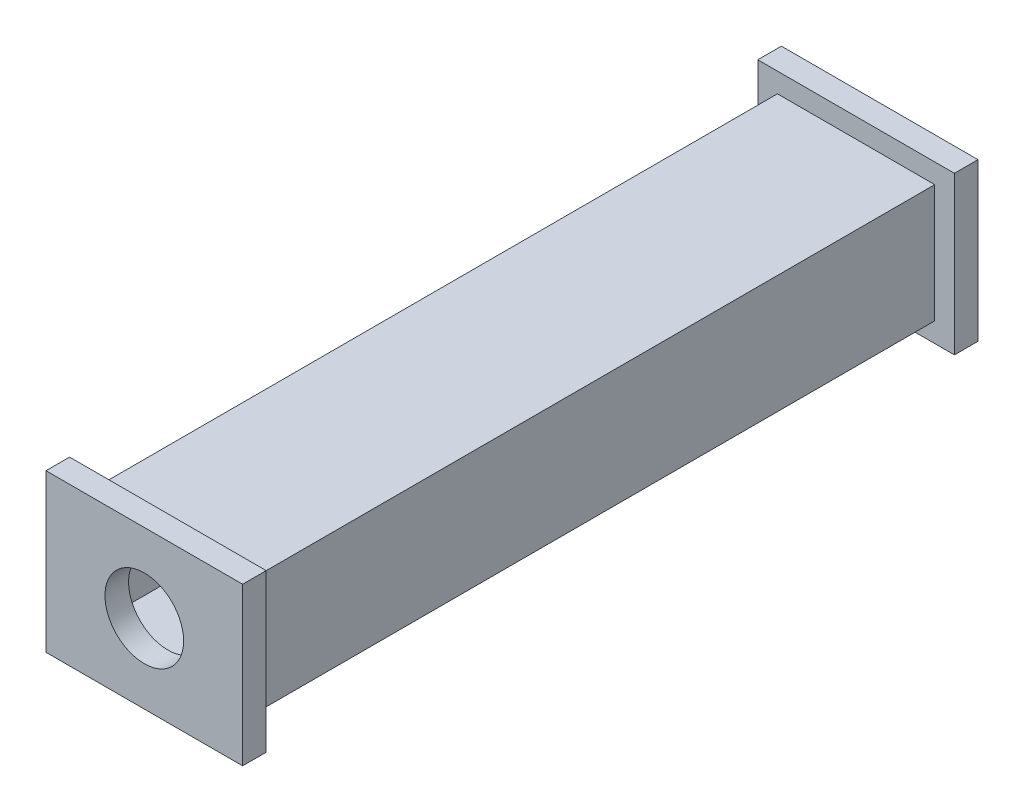
ISO-10303-21;
HEADER;
FILE_DESCRIPTION(('STEP AP214'),'2;1');
FILE_NAME('part.step','',(''),(''),'','','');
FILE_SCHEMA(('AUTOMOTIVE_DESIGN { 1 0 10303 214 1 1 1 1 }'));
ENDSEC;
DATA;
#1=APPLICATION_CONTEXT('core data for automotive mechanical design processes');
#2=APPLICATION_PROTOCOL_DEFINITION('international standard','automotive_design',2000,#1);
#3=PRODUCT_CONTEXT('',#1,'mechanical');
#4=PRODUCT('Part','Part','',(#3));
#5=PRODUCT_RELATED_PRODUCT_CATEGORY('part','',(#4));
#6=PRODUCT_DEFINITION_FORMATION('','',#4);
#7=PRODUCT_DEFINITION_CONTEXT('part definition',#1,'design');
#8=PRODUCT_DEFINITION('design','',#6,#7);
#9=PRODUCT_DEFINITION_SHAPE('','',#8);
#10=(LENGTH_UNIT() NAMED_UNIT(*) SI_UNIT(.MILLI.,.METRE.));
#11=(NAMED_UNIT(*) PLANE_ANGLE_UNIT() SI_UNIT($,.RADIAN.));
#12=(NAMED_UNIT(*) SI_UNIT($,.STERADIAN.) SOLID_ANGLE_UNIT());
#13=UNCERTAINTY_MEASURE_WITH_UNIT(LENGTH_MEASURE(1.E-05),#10,'distance_accuracy_value','');
#14=(GEOMETRIC_REPRESENTATION_CONTEXT(3) GLOBAL_UNCERTAINTY_ASSIGNED_CONTEXT((#13)) GLOBAL_UNIT_ASSIGNED_CONTEXT((#10,
#11,#12)) REPRESENTATION_CONTEXT('',''));
#15=CARTESIAN_POINT('',(0.,0.,0.));
#16=DIRECTION('',(0.,0.,1.));
#17=DIRECTION('',(1.,0.,0.));
#18=AXIS2_PLACEMENT_3D('',#15,#16,#17);
#19=CARTESIAN_POINT('',(-40.,30.,175.));
#20=DIRECTION('',(1.,0.,0.));
#21=DIRECTION('',(0.,0.,-1.));
#22=AXIS2_PLACEMENT_3D('',#19,#20,#21);
#23=PLANE('',#22);
#24=DIRECTION('',(0.,-1.,0.));
#25=VECTOR('',#24,1.);
#26=CARTESIAN_POINT('',(-40.,30.,-175.));
#27=LINE('',#26,#25);
#28=CARTESIAN_POINT('',(-40.,30.,-175.));
#29=VERTEX_POINT('',#28);
#30=CARTESIAN_POINT('',(-40.,-30.,-175.));
#31=VERTEX_POINT('',#30);
#32=EDGE_CURVE('E257',#29,#31,#27,.T.);
#33=ORIENTED_EDGE('',*,*,#32,.T.);
#34=DIRECTION('',(0.,0.,-1.));
#35=VECTOR('',#34,1.);
#36=CARTESIAN_POINT('',(-40.,-30.,175.));
#37=LINE('',#36,#35);
#38=CARTESIAN_POINT('',(-40.,-30.,175.));
#39=VERTEX_POINT('',#38);
#40=EDGE_CURVE('E11',#39,#31,#37,.T.);
#41=ORIENTED_EDGE('',*,*,#40,.F.);
#42=DIRECTION('',(0.,-1.,0.));
#43=VECTOR('',#42,1.);
#44=CARTESIAN_POINT('',(-40.,30.,175.));
#45=LINE('',#44,#43);
#46=CARTESIAN_POINT('',(-40.,30.,175.));
#47=VERTEX_POINT('',#46);
#48=EDGE_CURVE('E258',#47,#39,#45,.T.);
#49=ORIENTED_EDGE('',*,*,#48,.F.);
#50=DIRECTION('',(0.,0.,-1.));
#51=VECTOR('',#50,1.);
#52=CARTESIAN_POINT('',(-40.,30.,175.));
#53=LINE('',#52,#51);
#54=EDGE_CURVE('E271',#47,#29,#53,.T.);
#55=ORIENTED_EDGE('',*,*,#54,.T.);
#56=EDGE_LOOP('',(#33,#41,#49,#55));
#57=FACE_BOUND('',#56,.T.);
#58=ADVANCED_FACE('F39',(#57),#23,.F.);
#59=CARTESIAN_POINT('',(-40.,-30.,175.));
#60=DIRECTION('',(0.,1.,0.));
#61=DIRECTION('',(0.,0.,1.));
#62=AXIS2_PLACEMENT_3D('',#59,#60,#61);
#63=PLANE('',#62);
#64=DIRECTION('',(1.,0.,0.));
#65=VECTOR('',#64,1.);
#66=CARTESIAN_POINT('',(-40.,-30.,-175.));
#67=LINE('',#66,#65);
#68=CARTESIAN_POINT('',(40.,-30.,-175.));
#69=VERTEX_POINT('',#68);
#70=EDGE_CURVE('E274',#31,#69,#67,.T.);
#71=ORIENTED_EDGE('',*,*,#70,.T.);
#72=DIRECTION('',(0.,0.,-1.));
#73=VECTOR('',#72,1.);
#74=CARTESIAN_POINT('',(40.,-30.,175.));
#75=LINE('',#74,#73);
#76=CARTESIAN_POINT('',(40.,-30.,175.));
#77=VERTEX_POINT('',#76);
#78=EDGE_CURVE('E46',#77,#69,#75,.T.);
#79=ORIENTED_EDGE('',*,*,#78,.F.);
#80=DIRECTION('',(1.,0.,0.));
#81=VECTOR('',#80,1.);
#82=CARTESIAN_POINT('',(-40.,-30.,175.));
#83=LINE('',#82,#81);
#84=EDGE_CURVE('E261',#39,#77,#83,.T.);
#85=ORIENTED_EDGE('',*,*,#84,.F.);
#86=ORIENTED_EDGE('',*,*,#40,.T.);
#87=EDGE_LOOP('',(#71,#79,#85,#86));
#88=FACE_BOUND('',#87,.T.);
#89=ADVANCED_FACE('F284',(#88),#63,.F.);
#90=CARTESIAN_POINT('',(40.,30.,175.));
#91=DIRECTION('',(-1.,0.,0.));
#92=DIRECTION('',(0.,0.,1.));
#93=AXIS2_PLACEMENT_3D('',#90,#91,#92);
#94=PLANE('',#93);
#95=DIRECTION('',(0.,1.,0.));
#96=VECTOR('',#95,1.);
#97=CARTESIAN_POINT('',(40.,30.,-175.));
#98=LINE('',#97,#96);
#99=CARTESIAN_POINT('',(40.,30.,-175.));
#100=VERTEX_POINT('',#99);
#101=EDGE_CURVE('E74',#69,#100,#98,.T.);
#102=ORIENTED_EDGE('',*,*,#101,.T.);
#103=DIRECTION('',(0.,0.,-1.));
#104=VECTOR('',#103,1.);
#105=CARTESIAN_POINT('',(40.,30.,175.));
#106=LINE('',#105,#104);
#107=CARTESIAN_POINT('',(40.,30.,175.));
#108=VERTEX_POINT('',#107);
#109=EDGE_CURVE('E62',#108,#100,#106,.T.);
#110=ORIENTED_EDGE('',*,*,#109,.F.);
#111=DIRECTION('',(0.,1.,0.));
#112=VECTOR('',#111,1.);
#113=CARTESIAN_POINT('',(40.,30.,175.));
#114=LINE('',#113,#112);
#115=EDGE_CURVE('E265',#77,#108,#114,.T.);
#116=ORIENTED_EDGE('',*,*,#115,.F.);
#117=ORIENTED_EDGE('',*,*,#78,.T.);
#118=EDGE_LOOP('',(#102,#110,#116,#117));
#119=FACE_BOUND('',#118,.T.);
#120=ADVANCED_FACE('F282',(#119),#94,.F.);
#121=CARTESIAN_POINT('',(-40.,30.,175.));
#122=DIRECTION('',(0.,-1.,0.));
#123=DIRECTION('',(0.,0.,-1.));
#124=AXIS2_PLACEMENT_3D('',#121,#122,#123);
#125=PLANE('',#124);
#126=DIRECTION('',(-1.,0.,0.));
#127=VECTOR('',#126,1.);
#128=CARTESIAN_POINT('',(-40.,30.,-175.));
#129=LINE('',#128,#127);
#130=EDGE_CURVE('E262',#100,#29,#129,.T.);
#131=ORIENTED_EDGE('',*,*,#130,.T.);
#132=ORIENTED_EDGE('',*,*,#54,.F.);
#133=DIRECTION('',(-1.,0.,0.));
#134=VECTOR('',#133,1.);
#135=CARTESIAN_POINT('',(-40.,30.,175.));
#136=LINE('',#135,#134);
#137=EDGE_CURVE('E268',#108,#47,#136,.T.);
#138=ORIENTED_EDGE('',*,*,#137,.F.);
#139=ORIENTED_EDGE('',*,*,#109,.T.);
#140=EDGE_LOOP('',(#131,#132,#138,#139));
#141=FACE_BOUND('',#140,.T.);
#142=ADVANCED_FACE('F291',(#141),#125,.F.);
#143=CARTESIAN_POINT('',(-34.,24.,175.));
#144=DIRECTION('',(1.,0.,0.));
#145=DIRECTION('',(0.,0.,-1.));
#146=AXIS2_PLACEMENT_3D('',#143,#144,#145);
#147=PLANE('',#146);
#148=DIRECTION('',(0.,-1.,0.));
#149=VECTOR('',#148,1.);
#150=CARTESIAN_POINT('',(-34.,24.,-175.));
#151=LINE('',#150,#149);
#152=CARTESIAN_POINT('',(-34.,24.,-175.));
#153=VERTEX_POINT('',#152);
#154=CARTESIAN_POINT('',(-34.,-24.,-175.));
#155=VERTEX_POINT('',#154);
#156=EDGE_CURVE('E228',#153,#155,#151,.T.);
#157=ORIENTED_EDGE('',*,*,#156,.F.);
#158=DIRECTION('',(0.,0.,-1.));
#159=VECTOR('',#158,1.);
#160=CARTESIAN_POINT('',(-34.,24.,175.));
#161=LINE('',#160,#159);
#162=CARTESIAN_POINT('',(-34.,24.,175.));
#163=VERTEX_POINT('',#162);
#164=EDGE_CURVE('E239',#163,#153,#161,.T.);
#165=ORIENTED_EDGE('',*,*,#164,.F.);
#166=DIRECTION('',(0.,-1.,0.));
#167=VECTOR('',#166,1.);
#168=CARTESIAN_POINT('',(-34.,24.,175.));
#169=LINE('',#168,#167);
#170=CARTESIAN_POINT('',(-34.,-24.,175.));
#171=VERTEX_POINT('',#170);
#172=EDGE_CURVE('E229',#163,#171,#169,.T.);
#173=ORIENTED_EDGE('',*,*,#172,.T.);
#174=DIRECTION('',(0.,0.,-1.));
#175=VECTOR('',#174,1.);
#176=CARTESIAN_POINT('',(-34.,-24.,175.));
#177=LINE('',#176,#175);
#178=EDGE_CURVE('E254',#171,#155,#177,.T.);
#179=ORIENTED_EDGE('',*,*,#178,.T.);
#180=EDGE_LOOP('',(#157,#165,#173,#179));
#181=FACE_BOUND('',#180,.T.);
#182=ADVANCED_FACE('F325',(#181),#147,.T.);
#183=CARTESIAN_POINT('',(-34.,-24.,175.));
#184=DIRECTION('',(0.,1.,0.));
#185=DIRECTION('',(0.,0.,1.));
#186=AXIS2_PLACEMENT_3D('',#183,#184,#185);
#187=PLANE('',#186);
#188=DIRECTION('',(1.,0.,0.));
#189=VECTOR('',#188,1.);
#190=CARTESIAN_POINT('',(-34.,-24.,-175.));
#191=LINE('',#190,#189);
#192=CARTESIAN_POINT('',(34.,-24.,-175.));
#193=VERTEX_POINT('',#192);
#194=EDGE_CURVE('E242',#155,#193,#191,.T.);
#195=ORIENTED_EDGE('',*,*,#194,.F.);
#196=ORIENTED_EDGE('',*,*,#178,.F.);
#197=DIRECTION('',(1.,0.,0.));
#198=VECTOR('',#197,1.);
#199=CARTESIAN_POINT('',(-34.,-24.,175.));
#200=LINE('',#199,#198);
#201=CARTESIAN_POINT('',(34.,-24.,175.));
#202=VERTEX_POINT('',#201);
#203=EDGE_CURVE('E232',#171,#202,#200,.T.);
#204=ORIENTED_EDGE('',*,*,#203,.T.);
#205=DIRECTION('',(0.,0.,-1.));
#206=VECTOR('',#205,1.);
#207=CARTESIAN_POINT('',(34.,-24.,175.));
#208=LINE('',#207,#206);
#209=EDGE_CURVE('E252',#202,#193,#208,.T.);
#210=ORIENTED_EDGE('',*,*,#209,.T.);
#211=EDGE_LOOP('',(#195,#196,#204,#210));
#212=FACE_BOUND('',#211,.T.);
#213=ADVANCED_FACE('F328',(#212),#187,.T.);
#214=CARTESIAN_POINT('',(34.,24.,175.));
#215=DIRECTION('',(-1.,0.,0.));
#216=DIRECTION('',(0.,0.,1.));
#217=AXIS2_PLACEMENT_3D('',#214,#215,#216);
#218=PLANE('',#217);
#219=DIRECTION('',(0.,1.,0.));
#220=VECTOR('',#219,1.);
#221=CARTESIAN_POINT('',(34.,24.,-175.));
#222=LINE('',#221,#220);
#223=CARTESIAN_POINT('',(34.,24.,-175.));
#224=VERTEX_POINT('',#223);
#225=EDGE_CURVE('E245',#193,#224,#222,.T.);
#226=ORIENTED_EDGE('',*,*,#225,.F.);
#227=ORIENTED_EDGE('',*,*,#209,.F.);
#228=DIRECTION('',(0.,1.,0.));
#229=VECTOR('',#228,1.);
#230=CARTESIAN_POINT('',(34.,24.,175.));
#231=LINE('',#230,#229);
#232=CARTESIAN_POINT('',(34.,24.,175.));
#233=VERTEX_POINT('',#232);
#234=EDGE_CURVE('E236',#202,#233,#231,.T.);
#235=ORIENTED_EDGE('',*,*,#234,.T.);
#236=DIRECTION('',(0.,0.,-1.));
#237=VECTOR('',#236,1.);
#238=CARTESIAN_POINT('',(34.,24.,175.));
#239=LINE('',#238,#237);
#240=EDGE_CURVE('E83',#233,#224,#239,.T.);
#241=ORIENTED_EDGE('',*,*,#240,.T.);
#242=EDGE_LOOP('',(#226,#227,#235,#241));
#243=FACE_BOUND('',#242,.T.);
#244=ADVANCED_FACE('F306',(#243),#218,.T.);
#245=CARTESIAN_POINT('',(-34.,24.,175.));
#246=DIRECTION('',(0.,-1.,0.));
#247=DIRECTION('',(0.,0.,-1.));
#248=AXIS2_PLACEMENT_3D('',#245,#246,#247);
#249=PLANE('',#248);
#250=DIRECTION('',(-1.,0.,0.));
#251=VECTOR('',#250,1.);
#252=CARTESIAN_POINT('',(-34.,24.,-175.));
#253=LINE('',#252,#251);
#254=EDGE_CURVE('E233',#224,#153,#253,.T.);
#255=ORIENTED_EDGE('',*,*,#254,.F.);
#256=ORIENTED_EDGE('',*,*,#240,.F.);
#257=DIRECTION('',(-1.,0.,0.));
#258=VECTOR('',#257,1.);
#259=CARTESIAN_POINT('',(-34.,24.,175.));
#260=LINE('',#259,#258);
#261=EDGE_CURVE('E53',#233,#163,#260,.T.);
#262=ORIENTED_EDGE('',*,*,#261,.T.);
#263=ORIENTED_EDGE('',*,*,#164,.T.);
#264=EDGE_LOOP('',(#255,#256,#262,#263));
#265=FACE_BOUND('',#264,.T.);
#266=ADVANCED_FACE('F296',(#265),#249,.T.);
#267=CARTESIAN_POINT('',(0.,0.,175.));
#268=DIRECTION('',(0.,0.,1.));
#269=DIRECTION('',(1.,0.,0.));
#270=AXIS2_PLACEMENT_3D('',#267,#268,#269);
#271=PLANE('',#270);
#272=DIRECTION('',(0.,-1.,0.));
#273=VECTOR('',#272,1.);
#274=CARTESIAN_POINT('',(-50.,40.,175.));
#275=LINE('',#274,#273);
#276=CARTESIAN_POINT('',(-50.,40.,175.));
#277=VERTEX_POINT('',#276);
#278=CARTESIAN_POINT('',(-50.,-40.,175.));
#279=VERTEX_POINT('',#278);
#280=EDGE_CURVE('E197',#277,#279,#275,.T.);
#281=ORIENTED_EDGE('',*,*,#280,.F.);
#282=DIRECTION('',(-1.,0.,0.));
#283=VECTOR('',#282,1.);
#284=CARTESIAN_POINT('',(-50.,40.,175.));
#285=LINE('',#284,#283);
#286=CARTESIAN_POINT('',(50.,40.,175.));
#287=VERTEX_POINT('',#286);
#288=EDGE_CURVE('E203',#287,#277,#285,.T.);
#289=ORIENTED_EDGE('',*,*,#288,.F.);
#290=DIRECTION('',(0.,1.,0.));
#291=VECTOR('',#290,1.);
#292=CARTESIAN_POINT('',(50.,40.,175.));
#293=LINE('',#292,#291);
#294=CARTESIAN_POINT('',(50.,-40.,175.));
#295=VERTEX_POINT('',#294);
#296=EDGE_CURVE('E214',#295,#287,#293,.T.);
#297=ORIENTED_EDGE('',*,*,#296,.F.);
#298=DIRECTION('',(1.,0.,0.));
#299=VECTOR('',#298,1.);
#300=CARTESIAN_POINT('',(-50.,-40.,175.));
#301=LINE('',#300,#299);
#302=EDGE_CURVE('E212',#279,#295,#301,.T.);
#303=ORIENTED_EDGE('',*,*,#302,.F.);
#304=EDGE_LOOP('',(#281,#289,#297,#303));
#305=FACE_BOUND('',#304,.T.);
#306=ORIENTED_EDGE('',*,*,#137,.T.);
#307=ORIENTED_EDGE('',*,*,#48,.T.);
#308=ORIENTED_EDGE('',*,*,#84,.T.);
#309=ORIENTED_EDGE('',*,*,#115,.T.);
#310=EDGE_LOOP('',(#306,#307,#308,#309));
#311=FACE_BOUND('',#310,.T.);
#312=ADVANCED_FACE('F293',(#305,#311),#271,.F.);
#313=CARTESIAN_POINT('',(0.,0.,187.));
#314=DIRECTION('',(0.,0.,1.));
#315=DIRECTION('',(1.,0.,0.));
#316=AXIS2_PLACEMENT_3D('',#313,#314,#315);
#317=PLANE('',#316);
#318=DIRECTION('',(0.,-1.,0.));
#319=VECTOR('',#318,1.);
#320=CARTESIAN_POINT('',(-50.,40.,187.));
#321=LINE('',#320,#319);
#322=CARTESIAN_POINT('',(-50.,40.,187.));
#323=VERTEX_POINT('',#322);
#324=CARTESIAN_POINT('',(-50.,-40.,187.));
#325=VERTEX_POINT('',#324);
#326=EDGE_CURVE('E199',#323,#325,#321,.T.);
#327=ORIENTED_EDGE('',*,*,#326,.T.);
#328=DIRECTION('',(1.,0.,0.));
#329=VECTOR('',#328,1.);
#330=CARTESIAN_POINT('',(-50.,-40.,187.));
#331=LINE('',#330,#329);
#332=CARTESIAN_POINT('',(50.,-40.,187.));
#333=VERTEX_POINT('',#332);
#334=EDGE_CURVE('E202',#325,#333,#331,.T.);
#335=ORIENTED_EDGE('',*,*,#334,.T.);
#336=DIRECTION('',(0.,1.,0.));
#337=VECTOR('',#336,1.);
#338=CARTESIAN_POINT('',(50.,40.,187.));
#339=LINE('',#338,#337);
#340=CARTESIAN_POINT('',(50.,40.,187.));
#341=VERTEX_POINT('',#340);
#342=EDGE_CURVE('E205',#333,#341,#339,.T.);
#343=ORIENTED_EDGE('',*,*,#342,.T.);
#344=DIRECTION('',(-1.,0.,0.));
#345=VECTOR('',#344,1.);
#346=CARTESIAN_POINT('',(-50.,40.,187.));
#347=LINE('',#346,#345);
#348=EDGE_CURVE('E207',#341,#323,#347,.T.);
#349=ORIENTED_EDGE('',*,*,#348,.T.);
#350=EDGE_LOOP('',(#327,#335,#343,#349));
#351=FACE_BOUND('',#350,.T.);
#352=CARTESIAN_POINT('',(0.,0.,187.));
#353=DIRECTION('',(0.,0.,1.));
#354=DIRECTION('',(1.,0.,0.));
#355=AXIS2_PLACEMENT_3D('',#352,#353,#354);
#356=CIRCLE('',#355,20.);
#357=CARTESIAN_POINT('',(20.,0.,187.));
#358=VERTEX_POINT('',#357);
#359=EDGE_CURVE('E190',#358,#358,#356,.T.);
#360=ORIENTED_EDGE('',*,*,#359,.F.);
#361=EDGE_LOOP('',(#360));
#362=FACE_BOUND('',#361,.T.);
#363=ADVANCED_FACE('F295',(#351,#362),#317,.T.);
#364=ORIENTED_EDGE('',*,*,#203,.F.);
#365=ORIENTED_EDGE('',*,*,#172,.F.);
#366=ORIENTED_EDGE('',*,*,#261,.F.);
#367=ORIENTED_EDGE('',*,*,#234,.F.);
#368=EDGE_LOOP('',(#364,#365,#366,#367));
#369=FACE_BOUND('',#368,.T.);
#370=CARTESIAN_POINT('',(0.,0.,175.));
#371=DIRECTION('',(0.,0.,1.));
#372=DIRECTION('',(1.,0.,0.));
#373=AXIS2_PLACEMENT_3D('',#370,#371,#372);
#374=CIRCLE('',#373,20.);
#375=CARTESIAN_POINT('',(20.,0.,175.));
#376=VERTEX_POINT('',#375);
#377=EDGE_CURVE('E187',#376,#376,#374,.T.);
#378=ORIENTED_EDGE('',*,*,#377,.T.);
#379=EDGE_LOOP('',(#378));
#380=FACE_BOUND('',#379,.T.);
#381=ADVANCED_FACE('F299',(#369,#380),#271,.F.);
#382=CARTESIAN_POINT('',(-50.,40.,187.));
#383=DIRECTION('',(1.,0.,0.));
#384=DIRECTION('',(0.,0.,-1.));
#385=AXIS2_PLACEMENT_3D('',#382,#383,#384);
#386=PLANE('',#385);
#387=ORIENTED_EDGE('',*,*,#280,.T.);
#388=DIRECTION('',(0.,0.,-1.));
#389=VECTOR('',#388,1.);
#390=CARTESIAN_POINT('',(-50.,-40.,187.));
#391=LINE('',#390,#389);
#392=EDGE_CURVE('E225',#325,#279,#391,.T.);
#393=ORIENTED_EDGE('',*,*,#392,.F.);
#394=ORIENTED_EDGE('',*,*,#326,.F.);
#395=DIRECTION('',(0.,0.,-1.));
#396=VECTOR('',#395,1.);
#397=CARTESIAN_POINT('',(-50.,40.,187.));
#398=LINE('',#397,#396);
#399=EDGE_CURVE('E209',#323,#277,#398,.T.);
#400=ORIENTED_EDGE('',*,*,#399,.T.);
#401=EDGE_LOOP('',(#387,#393,#394,#400));
#402=FACE_BOUND('',#401,.T.);
#403=ADVANCED_FACE('F312',(#402),#386,.F.);
#404=CARTESIAN_POINT('',(-50.,-40.,187.));
#405=DIRECTION('',(0.,1.,0.));
#406=DIRECTION('',(0.,0.,1.));
#407=AXIS2_PLACEMENT_3D('',#404,#405,#406);
#408=PLANE('',#407);
#409=ORIENTED_EDGE('',*,*,#302,.T.);
#410=DIRECTION('',(0.,0.,-1.));
#411=VECTOR('',#410,1.);
#412=CARTESIAN_POINT('',(50.,-40.,187.));
#413=LINE('',#412,#411);
#414=EDGE_CURVE('E222',#333,#295,#413,.T.);
#415=ORIENTED_EDGE('',*,*,#414,.F.);
#416=ORIENTED_EDGE('',*,*,#334,.F.);
#417=ORIENTED_EDGE('',*,*,#392,.T.);
#418=EDGE_LOOP('',(#409,#415,#416,#417));
#419=FACE_BOUND('',#418,.T.);
#420=ADVANCED_FACE('F337',(#419),#408,.F.);
#421=CARTESIAN_POINT('',(50.,40.,187.));
#422=DIRECTION('',(-1.,0.,0.));
#423=DIRECTION('',(0.,0.,1.));
#424=AXIS2_PLACEMENT_3D('',#421,#422,#423);
#425=PLANE('',#424);
#426=ORIENTED_EDGE('',*,*,#296,.T.);
#427=DIRECTION('',(0.,0.,-1.));
#428=VECTOR('',#427,1.);
#429=CARTESIAN_POINT('',(50.,40.,187.));
#430=LINE('',#429,#428);
#431=EDGE_CURVE('E219',#341,#287,#430,.T.);
#432=ORIENTED_EDGE('',*,*,#431,.F.);
#433=ORIENTED_EDGE('',*,*,#342,.F.);
#434=ORIENTED_EDGE('',*,*,#414,.T.);
#435=EDGE_LOOP('',(#426,#432,#433,#434));
#436=FACE_BOUND('',#435,.T.);
#437=ADVANCED_FACE('F341',(#436),#425,.F.);
#438=CARTESIAN_POINT('',(-50.,40.,187.));
#439=DIRECTION('',(0.,-1.,0.));
#440=DIRECTION('',(0.,0.,-1.));
#441=AXIS2_PLACEMENT_3D('',#438,#439,#440);
#442=PLANE('',#441);
#443=ORIENTED_EDGE('',*,*,#288,.T.);
#444=ORIENTED_EDGE('',*,*,#399,.F.);
#445=ORIENTED_EDGE('',*,*,#348,.F.);
#446=ORIENTED_EDGE('',*,*,#431,.T.);
#447=EDGE_LOOP('',(#443,#444,#445,#446));
#448=FACE_BOUND('',#447,.T.);
#449=ADVANCED_FACE('F344',(#448),#442,.F.);
#450=CARTESIAN_POINT('',(0.,0.,187.));
#451=DIRECTION('',(0.,0.,-1.));
#452=DIRECTION('',(-1.,0.,0.));
#453=AXIS2_PLACEMENT_3D('',#450,#451,#452);
#454=CYLINDRICAL_SURFACE('',#453,20.);
#455=ORIENTED_EDGE('',*,*,#359,.T.);
#456=EDGE_LOOP('',(#455));
#457=FACE_BOUND('',#456,.T.);
#458=ORIENTED_EDGE('',*,*,#377,.F.);
#459=EDGE_LOOP('',(#458));
#460=FACE_BOUND('',#459,.T.);
#461=ADVANCED_FACE('F347',(#457,#460),#454,.F.);
#462=CARTESIAN_POINT('',(0.,0.,-175.));
#463=DIRECTION('',(0.,0.,-1.));
#464=DIRECTION('',(-1.,0.,0.));
#465=AXIS2_PLACEMENT_3D('',#462,#463,#464);
#466=PLANE('',#465);
#467=CARTESIAN_POINT('',(0.,0.,-175.));
#468=DIRECTION('',(0.,0.,-1.));
#469=DIRECTION('',(-1.,0.,0.));
#470=AXIS2_PLACEMENT_3D('',#467,#468,#469);
#471=CIRCLE('',#470,20.);
#472=CARTESIAN_POINT('',(-20.,0.,-175.));
#473=VERTEX_POINT('',#472);
#474=EDGE_CURVE('E400',#473,#473,#471,.T.);
#475=ORIENTED_EDGE('',*,*,#474,.T.);
#476=EDGE_LOOP('',(#475));
#477=FACE_BOUND('',#476,.T.);
#478=ORIENTED_EDGE('',*,*,#254,.T.);
#479=ORIENTED_EDGE('',*,*,#156,.T.);
#480=ORIENTED_EDGE('',*,*,#194,.T.);
#481=ORIENTED_EDGE('',*,*,#225,.T.);
#482=EDGE_LOOP('',(#478,#479,#480,#481));
#483=FACE_BOUND('',#482,.T.);
#484=ADVANCED_FACE('F351',(#477,#483),#466,.F.);
#485=CARTESIAN_POINT('',(0.,0.,-187.));
#486=DIRECTION('',(0.,0.,-1.));
#487=DIRECTION('',(-1.,0.,0.));
#488=AXIS2_PLACEMENT_3D('',#485,#486,#487);
#489=PLANE('',#488);
#490=DIRECTION('',(0.,-1.,0.));
#491=VECTOR('',#490,1.);
#492=CARTESIAN_POINT('',(50.,40.,-187.));
#493=LINE('',#492,#491);
#494=CARTESIAN_POINT('',(50.,40.,-187.));
#495=VERTEX_POINT('',#494);
#496=CARTESIAN_POINT('',(50.,-40.,-187.));
#497=VERTEX_POINT('',#496);
#498=EDGE_CURVE('E172',#495,#497,#493,.T.);
#499=ORIENTED_EDGE('',*,*,#498,.T.);
#500=DIRECTION('',(-1.,0.,0.));
#501=VECTOR('',#500,1.);
#502=CARTESIAN_POINT('',(50.,-40.,-187.));
#503=LINE('',#502,#501);
#504=CARTESIAN_POINT('',(-50.,-40.,-187.));
#505=VERTEX_POINT('',#504);
#506=EDGE_CURVE('E161',#497,#505,#503,.T.);
#507=ORIENTED_EDGE('',*,*,#506,.T.);
#508=DIRECTION('',(0.,1.,0.));
#509=VECTOR('',#508,1.);
#510=CARTESIAN_POINT('',(-50.,40.,-187.));
#511=LINE('',#510,#509);
#512=CARTESIAN_POINT('',(-50.,40.,-187.));
#513=VERTEX_POINT('',#512);
#514=EDGE_CURVE('E171',#505,#513,#511,.T.);
#515=ORIENTED_EDGE('',*,*,#514,.T.);
#516=DIRECTION('',(1.,0.,0.));
#517=VECTOR('',#516,1.);
#518=CARTESIAN_POINT('',(50.,40.,-187.));
#519=LINE('',#518,#517);
#520=EDGE_CURVE('E178',#513,#495,#519,.T.);
#521=ORIENTED_EDGE('',*,*,#520,.T.);
#522=EDGE_LOOP('',(#499,#507,#515,#521));
#523=FACE_BOUND('',#522,.T.);
#524=CARTESIAN_POINT('',(0.,0.,-187.));
#525=DIRECTION('',(0.,0.,-1.));
#526=DIRECTION('',(-1.,0.,0.));
#527=AXIS2_PLACEMENT_3D('',#524,#525,#526);
#528=CIRCLE('',#527,20.);
#529=CARTESIAN_POINT('',(-20.,0.,-187.));
#530=VERTEX_POINT('',#529);
#531=EDGE_CURVE('E397',#530,#530,#528,.T.);
#532=ORIENTED_EDGE('',*,*,#531,.F.);
#533=EDGE_LOOP('',(#532));
#534=FACE_BOUND('',#533,.T.);
#535=ADVANCED_FACE('F175',(#523,#534),#489,.T.);
#536=ORIENTED_EDGE('',*,*,#32,.F.);
#537=ORIENTED_EDGE('',*,*,#130,.F.);
#538=ORIENTED_EDGE('',*,*,#101,.F.);
#539=ORIENTED_EDGE('',*,*,#70,.F.);
#540=EDGE_LOOP('',(#536,#537,#538,#539));
#541=FACE_BOUND('',#540,.T.);
#542=DIRECTION('',(0.,-1.,0.));
#543=VECTOR('',#542,1.);
#544=CARTESIAN_POINT('',(50.,40.,-175.));
#545=LINE('',#544,#543);
#546=CARTESIAN_POINT('',(50.,40.,-175.));
#547=VERTEX_POINT('',#546);
#548=CARTESIAN_POINT('',(50.,-40.,-175.));
#549=VERTEX_POINT('',#548);
#550=EDGE_CURVE('E186',#547,#549,#545,.T.);
#551=ORIENTED_EDGE('',*,*,#550,.F.);
#552=DIRECTION('',(1.,0.,0.));
#553=VECTOR('',#552,1.);
#554=CARTESIAN_POINT('',(50.,40.,-175.));
#555=LINE('',#554,#553);
#556=CARTESIAN_POINT('',(-50.,40.,-175.));
#557=VERTEX_POINT('',#556);
#558=EDGE_CURVE('E182',#557,#547,#555,.T.);
#559=ORIENTED_EDGE('',*,*,#558,.F.);
#560=DIRECTION('',(0.,1.,0.));
#561=VECTOR('',#560,1.);
#562=CARTESIAN_POINT('',(-50.,40.,-175.));
#563=LINE('',#562,#561);
#564=CARTESIAN_POINT('',(-50.,-40.,-175.));
#565=VERTEX_POINT('',#564);
#566=EDGE_CURVE('E410',#565,#557,#563,.T.);
#567=ORIENTED_EDGE('',*,*,#566,.F.);
#568=DIRECTION('',(-1.,0.,0.));
#569=VECTOR('',#568,1.);
#570=CARTESIAN_POINT('',(50.,-40.,-175.));
#571=LINE('',#570,#569);
#572=EDGE_CURVE('E408',#549,#565,#571,.T.);
#573=ORIENTED_EDGE('',*,*,#572,.F.);
#574=EDGE_LOOP('',(#551,#559,#567,#573));
#575=FACE_BOUND('',#574,.T.);
#576=ADVANCED_FACE('F286',(#541,#575),#466,.F.);
#577=CARTESIAN_POINT('',(50.,40.,-187.));
#578=DIRECTION('',(-1.,0.,0.));
#579=DIRECTION('',(0.,0.,1.));
#580=AXIS2_PLACEMENT_3D('',#577,#578,#579);
#581=PLANE('',#580);
#582=ORIENTED_EDGE('',*,*,#550,.T.);
#583=DIRECTION('',(0.,0.,1.));
#584=VECTOR('',#583,1.);
#585=CARTESIAN_POINT('',(50.,-40.,-187.));
#586=LINE('',#585,#584);
#587=EDGE_CURVE('E165',#497,#549,#586,.T.);
#588=ORIENTED_EDGE('',*,*,#587,.F.);
#589=ORIENTED_EDGE('',*,*,#498,.F.);
#590=DIRECTION('',(0.,0.,1.));
#591=VECTOR('',#590,1.);
#592=CARTESIAN_POINT('',(50.,40.,-187.));
#593=LINE('',#592,#591);
#594=EDGE_CURVE('E406',#495,#547,#593,.T.);
#595=ORIENTED_EDGE('',*,*,#594,.T.);
#596=EDGE_LOOP('',(#582,#588,#589,#595));
#597=FACE_BOUND('',#596,.T.);
#598=ADVANCED_FACE('F184',(#597),#581,.F.);
#599=CARTESIAN_POINT('',(50.,-40.,-187.));
#600=DIRECTION('',(0.,1.,0.));
#601=DIRECTION('',(0.,0.,1.));
#602=AXIS2_PLACEMENT_3D('',#599,#600,#601);
#603=PLANE('',#602);
#604=ORIENTED_EDGE('',*,*,#572,.T.);
#605=DIRECTION('',(0.,0.,1.));
#606=VECTOR('',#605,1.);
#607=CARTESIAN_POINT('',(-50.,-40.,-187.));
#608=LINE('',#607,#606);
#609=EDGE_CURVE('E168',#505,#565,#608,.T.);
#610=ORIENTED_EDGE('',*,*,#609,.F.);
#611=ORIENTED_EDGE('',*,*,#506,.F.);
#612=ORIENTED_EDGE('',*,*,#587,.T.);
#613=EDGE_LOOP('',(#604,#610,#611,#612));
#614=FACE_BOUND('',#613,.T.);
#615=ADVANCED_FACE('F163',(#614),#603,.F.);
#616=CARTESIAN_POINT('',(-50.,40.,-187.));
#617=DIRECTION('',(1.,0.,0.));
#618=DIRECTION('',(0.,0.,-1.));
#619=AXIS2_PLACEMENT_3D('',#616,#617,#618);
#620=PLANE('',#619);
#621=ORIENTED_EDGE('',*,*,#566,.T.);
#622=DIRECTION('',(0.,0.,1.));
#623=VECTOR('',#622,1.);
#624=CARTESIAN_POINT('',(-50.,40.,-187.));
#625=LINE('',#624,#623);
#626=EDGE_CURVE('E192',#513,#557,#625,.T.);
#627=ORIENTED_EDGE('',*,*,#626,.F.);
#628=ORIENTED_EDGE('',*,*,#514,.F.);
#629=ORIENTED_EDGE('',*,*,#609,.T.);
#630=EDGE_LOOP('',(#621,#627,#628,#629));
#631=FACE_BOUND('',#630,.T.);
#632=ADVANCED_FACE('F378',(#631),#620,.F.);
#633=CARTESIAN_POINT('',(50.,40.,-187.));
#634=DIRECTION('',(0.,-1.,0.));
#635=DIRECTION('',(0.,0.,-1.));
#636=AXIS2_PLACEMENT_3D('',#633,#634,#635);
#637=PLANE('',#636);
#638=ORIENTED_EDGE('',*,*,#558,.T.);
#639=ORIENTED_EDGE('',*,*,#594,.F.);
#640=ORIENTED_EDGE('',*,*,#520,.F.);
#641=ORIENTED_EDGE('',*,*,#626,.T.);
#642=EDGE_LOOP('',(#638,#639,#640,#641));
#643=FACE_BOUND('',#642,.T.);
#644=ADVANCED_FACE('F381',(#643),#637,.F.);
#645=CARTESIAN_POINT('',(0.,0.,-187.));
#646=DIRECTION('',(0.,0.,1.));
#647=DIRECTION('',(1.,0.,0.));
#648=AXIS2_PLACEMENT_3D('',#645,#646,#647);
#649=CYLINDRICAL_SURFACE('',#648,20.);
#650=ORIENTED_EDGE('',*,*,#531,.T.);
#651=EDGE_LOOP('',(#650));
#652=FACE_BOUND('',#651,.T.);
#653=ORIENTED_EDGE('',*,*,#474,.F.);
#654=EDGE_LOOP('',(#653));
#655=FACE_BOUND('',#654,.T.);
#656=ADVANCED_FACE('F384',(#652,#655),#649,.F.);
#657=CLOSED_SHELL('',(#58,#89,#120,#142,#182,#213,#244,#266,#312,#363,#381,#403,#420,#437,#449,
#461,#484,#535,#576,#598,#615,#632,#644,#656));
#658=MANIFOLD_SOLID_BREP('B2',#657);
#659=ADVANCED_BREP_SHAPE_REPRESENTATION('',(#18,#658),#14);
#660=SHAPE_DEFINITION_REPRESENTATION(#9,#659);
ENDSEC;
END-ISO-10303-21;
